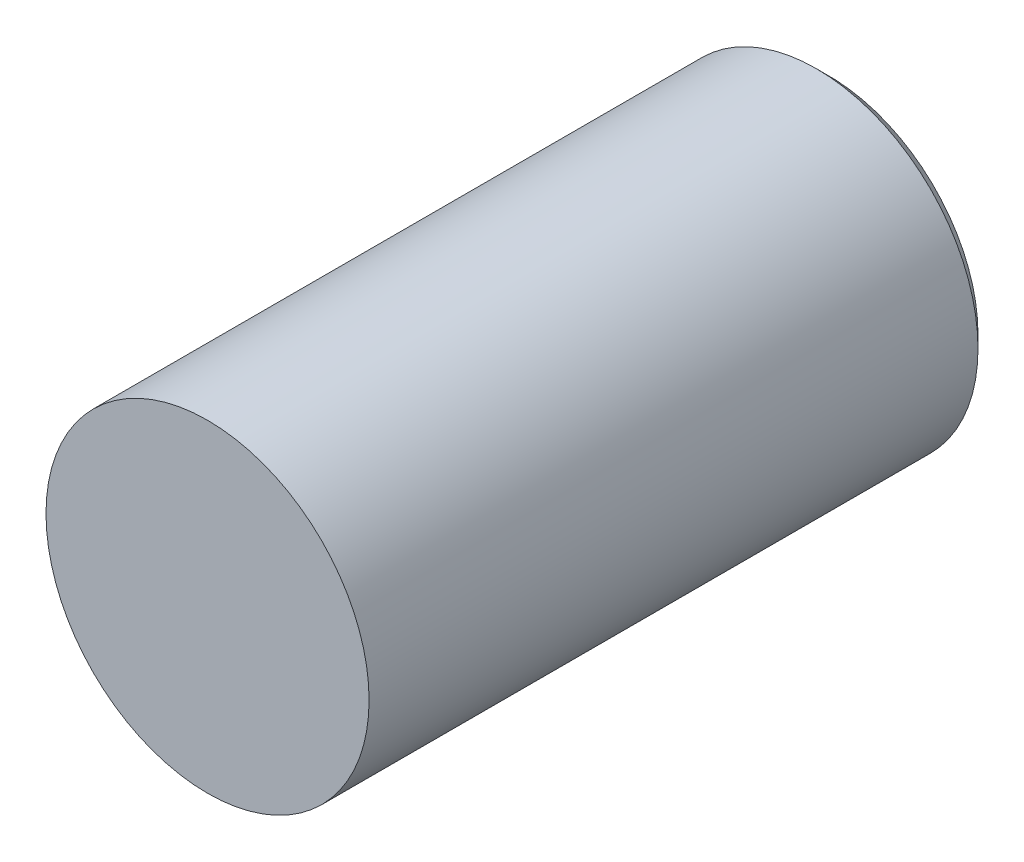
ISO-10303-21;
HEADER;
FILE_DESCRIPTION(('STEP AP214'),'2;1');
FILE_NAME('part.step','',(''),(''),'','','');
FILE_SCHEMA(('AUTOMOTIVE_DESIGN { 1 0 10303 214 1 1 1 1 }'));
ENDSEC;
DATA;
#1=APPLICATION_CONTEXT('core data for automotive mechanical design processes');
#2=APPLICATION_PROTOCOL_DEFINITION('international standard','automotive_design',2000,#1);
#3=PRODUCT_CONTEXT('',#1,'mechanical');
#4=PRODUCT('Part','Part','',(#3));
#5=PRODUCT_RELATED_PRODUCT_CATEGORY('part','',(#4));
#6=PRODUCT_DEFINITION_FORMATION('','',#4);
#7=PRODUCT_DEFINITION_CONTEXT('part definition',#1,'design');
#8=PRODUCT_DEFINITION('design','',#6,#7);
#9=PRODUCT_DEFINITION_SHAPE('','',#8);
#10=(LENGTH_UNIT() NAMED_UNIT(*) SI_UNIT(.MILLI.,.METRE.));
#11=(NAMED_UNIT(*) PLANE_ANGLE_UNIT() SI_UNIT($,.RADIAN.));
#12=(NAMED_UNIT(*) SI_UNIT($,.STERADIAN.) SOLID_ANGLE_UNIT());
#13=UNCERTAINTY_MEASURE_WITH_UNIT(LENGTH_MEASURE(1.E-05),#10,'distance_accuracy_value','');
#14=(GEOMETRIC_REPRESENTATION_CONTEXT(3) GLOBAL_UNCERTAINTY_ASSIGNED_CONTEXT((#13)) GLOBAL_UNIT_ASSIGNED_CONTEXT((#10,
#11,#12)) REPRESENTATION_CONTEXT('',''));
#15=CARTESIAN_POINT('',(0.,0.,0.));
#16=DIRECTION('',(0.,0.,1.));
#17=DIRECTION('',(1.,0.,0.));
#18=AXIS2_PLACEMENT_3D('',#15,#16,#17);
#19=CARTESIAN_POINT('',(0.,0.,15.));
#20=DIRECTION('',(0.,0.,-1.));
#21=DIRECTION('',(-1.,0.,0.));
#22=AXIS2_PLACEMENT_3D('',#19,#20,#21);
#23=CYLINDRICAL_SURFACE('',#22,2.6);
#24=CARTESIAN_POINT('',(0.,0.,0.300000000000003));
#25=DIRECTION('',(0.,0.,1.));
#26=DIRECTION('',(1.,0.,0.));
#27=AXIS2_PLACEMENT_3D('',#24,#25,#26);
#28=CIRCLE('',#27,2.6);
#29=CARTESIAN_POINT('',(2.6,0.,0.300000000000003));
#30=VERTEX_POINT('',#29);
#31=EDGE_CURVE('E128',#30,#30,#28,.F.);
#32=ORIENTED_EDGE('',*,*,#31,.T.);
#33=EDGE_LOOP('',(#32));
#34=FACE_BOUND('',#33,.T.);
#35=CARTESIAN_POINT('',(0.,0.,8.));
#36=DIRECTION('',(0.,0.,1.));
#37=DIRECTION('',(1.,0.,0.));
#38=AXIS2_PLACEMENT_3D('',#35,#36,#37);
#39=CIRCLE('',#38,2.6);
#40=CARTESIAN_POINT('',(1.6,2.04939015319192,8.));
#41=VERTEX_POINT('',#40);
#42=CARTESIAN_POINT('',(-1.6,2.04939015319192,8.));
#43=VERTEX_POINT('',#42);
#44=EDGE_CURVE('E106',#41,#43,#39,.T.);
#45=ORIENTED_EDGE('',*,*,#44,.T.);
#46=DIRECTION('',(0.,0.,1.));
#47=VECTOR('',#46,1.);
#48=CARTESIAN_POINT('',(-1.6,2.04939015319192,1.8));
#49=LINE('',#48,#47);
#50=CARTESIAN_POINT('',(-1.6,2.04939015319192,2.1));
#51=VERTEX_POINT('',#50);
#52=EDGE_CURVE('E96',#51,#43,#49,.T.);
#53=ORIENTED_EDGE('',*,*,#52,.F.);
#54=CARTESIAN_POINT('',(0.,0.,3.70000000000001));
#55=DIRECTION('',(0.70710678118655,0.,-0.707106781186546));
#56=DIRECTION('',(-0.707106781186546,0.,-0.70710678118655));
#57=AXIS2_PLACEMENT_3D('',#54,#55,#56);
#58=ELLIPSE('',#57,3.67695526217006,2.6);
#59=CARTESIAN_POINT('',(-1.9,1.77482393492988,1.8));
#60=VERTEX_POINT('',#59);
#61=EDGE_CURVE('E147',#51,#60,#58,.F.);
#62=ORIENTED_EDGE('',*,*,#61,.T.);
#63=CARTESIAN_POINT('',(0.,0.,1.8));
#64=DIRECTION('',(0.,0.,-1.));
#65=DIRECTION('',(-1.,0.,0.));
#66=AXIS2_PLACEMENT_3D('',#63,#64,#65);
#67=CIRCLE('',#66,2.6);
#68=CARTESIAN_POINT('',(-1.9,-1.77482393492988,1.8));
#69=VERTEX_POINT('',#68);
#70=EDGE_CURVE('E97',#69,#60,#67,.T.);
#71=ORIENTED_EDGE('',*,*,#70,.F.);
#72=CARTESIAN_POINT('',(0.,0.,3.70000000000001));
#73=DIRECTION('',(0.70710678118655,0.,-0.707106781186546));
#74=DIRECTION('',(-0.707106781186546,0.,-0.70710678118655));
#75=AXIS2_PLACEMENT_3D('',#72,#73,#74);
#76=ELLIPSE('',#75,3.67695526217006,2.6);
#77=CARTESIAN_POINT('',(-1.6,-2.04939015319192,2.1));
#78=VERTEX_POINT('',#77);
#79=EDGE_CURVE('E92',#69,#78,#76,.F.);
#80=ORIENTED_EDGE('',*,*,#79,.T.);
#81=DIRECTION('',(0.,0.,1.));
#82=VECTOR('',#81,1.);
#83=CARTESIAN_POINT('',(-1.6,-2.04939015319192,1.8));
#84=LINE('',#83,#82);
#85=CARTESIAN_POINT('',(-1.6,-2.04939015319192,8.));
#86=VERTEX_POINT('',#85);
#87=EDGE_CURVE('E86',#78,#86,#84,.T.);
#88=ORIENTED_EDGE('',*,*,#87,.T.);
#89=CARTESIAN_POINT('',(1.6,-2.04939015319192,8.));
#90=VERTEX_POINT('',#89);
#91=EDGE_CURVE('E89',#86,#90,#39,.T.);
#92=ORIENTED_EDGE('',*,*,#91,.T.);
#93=DIRECTION('',(0.,0.,1.));
#94=VECTOR('',#93,1.);
#95=CARTESIAN_POINT('',(1.6,-2.04939015319192,1.8));
#96=LINE('',#95,#94);
#97=CARTESIAN_POINT('',(1.6,-2.04939015319192,2.1));
#98=VERTEX_POINT('',#97);
#99=EDGE_CURVE('E118',#98,#90,#96,.T.);
#100=ORIENTED_EDGE('',*,*,#99,.F.);
#101=CARTESIAN_POINT('',(0.,0.,3.69999999999999));
#102=DIRECTION('',(0.707106781186546,0.,0.70710678118655));
#103=DIRECTION('',(0.70710678118655,0.,-0.707106781186546));
#104=AXIS2_PLACEMENT_3D('',#101,#102,#103);
#105=ELLIPSE('',#104,3.67695526217004,2.6);
#106=CARTESIAN_POINT('',(1.9,-1.77482393492988,1.8));
#107=VERTEX_POINT('',#106);
#108=EDGE_CURVE('E44',#98,#107,#105,.T.);
#109=ORIENTED_EDGE('',*,*,#108,.T.);
#110=CARTESIAN_POINT('',(0.,0.,1.8));
#111=DIRECTION('',(0.,0.,-1.));
#112=DIRECTION('',(-1.,0.,0.));
#113=AXIS2_PLACEMENT_3D('',#110,#111,#112);
#114=CIRCLE('',#113,2.6);
#115=CARTESIAN_POINT('',(1.9,1.77482393492988,1.8));
#116=VERTEX_POINT('',#115);
#117=EDGE_CURVE('E116',#116,#107,#114,.T.);
#118=ORIENTED_EDGE('',*,*,#117,.F.);
#119=CARTESIAN_POINT('',(0.,0.,3.69999999999999));
#120=DIRECTION('',(0.707106781186546,0.,0.70710678118655));
#121=DIRECTION('',(0.70710678118655,0.,-0.707106781186546));
#122=AXIS2_PLACEMENT_3D('',#119,#120,#121);
#123=ELLIPSE('',#122,3.67695526217004,2.6);
#124=CARTESIAN_POINT('',(1.6,2.04939015319192,2.1));
#125=VERTEX_POINT('',#124);
#126=EDGE_CURVE('E11',#116,#125,#123,.T.);
#127=ORIENTED_EDGE('',*,*,#126,.T.);
#128=DIRECTION('',(0.,0.,1.));
#129=VECTOR('',#128,1.);
#130=CARTESIAN_POINT('',(1.6,2.04939015319192,1.8));
#131=LINE('',#130,#129);
#132=EDGE_CURVE('E107',#125,#41,#131,.T.);
#133=ORIENTED_EDGE('',*,*,#132,.T.);
#134=EDGE_LOOP('',(#45,#53,#62,#71,#80,#88,#92,#100,#109,#118,#127,#133));
#135=FACE_BOUND('',#134,.T.);
#136=ADVANCED_FACE('F36',(#34,#135),#23,.F.);
#137=CARTESIAN_POINT('',(0.,0.,8.));
#138=DIRECTION('',(0.,0.,1.));
#139=DIRECTION('',(1.,0.,0.));
#140=AXIS2_PLACEMENT_3D('',#137,#138,#139);
#141=PLANE('',#140);
#142=DIRECTION('',(0.,-1.,0.));
#143=VECTOR('',#142,1.);
#144=CARTESIAN_POINT('',(-1.6,0.,8.));
#145=LINE('',#144,#143);
#146=EDGE_CURVE('E103',#43,#86,#145,.T.);
#147=ORIENTED_EDGE('',*,*,#146,.F.);
#148=ORIENTED_EDGE('',*,*,#44,.F.);
#149=DIRECTION('',(0.,-1.,0.));
#150=VECTOR('',#149,1.);
#151=CARTESIAN_POINT('',(1.6,0.,8.));
#152=LINE('',#151,#150);
#153=EDGE_CURVE('E105',#41,#90,#152,.T.);
#154=ORIENTED_EDGE('',*,*,#153,.T.);
#155=ORIENTED_EDGE('',*,*,#91,.F.);
#156=EDGE_LOOP('',(#147,#148,#154,#155));
#157=FACE_BOUND('',#156,.T.);
#158=ADVANCED_FACE('F101',(#157),#141,.F.);
#159=CARTESIAN_POINT('',(0.,0.,15.));
#160=DIRECTION('',(0.,0.,1.));
#161=DIRECTION('',(1.,0.,0.));
#162=AXIS2_PLACEMENT_3D('',#159,#160,#161);
#163=PLANE('',#162);
#164=CARTESIAN_POINT('',(0.,0.,15.));
#165=DIRECTION('',(0.,0.,1.));
#166=DIRECTION('',(1.,0.,0.));
#167=AXIS2_PLACEMENT_3D('',#164,#165,#166);
#168=CIRCLE('',#167,3.9);
#169=CARTESIAN_POINT('',(3.9,0.,15.));
#170=VERTEX_POINT('',#169);
#171=EDGE_CURVE('E122',#170,#170,#168,.T.);
#172=ORIENTED_EDGE('',*,*,#171,.T.);
#173=EDGE_LOOP('',(#172));
#174=FACE_BOUND('',#173,.T.);
#175=ADVANCED_FACE('F170',(#174),#163,.T.);
#176=CARTESIAN_POINT('',(0.,0.,0.));
#177=DIRECTION('',(0.,0.,1.));
#178=DIRECTION('',(1.,0.,0.));
#179=AXIS2_PLACEMENT_3D('',#176,#177,#178);
#180=PLANE('',#179);
#181=CARTESIAN_POINT('',(0.,0.,0.));
#182=DIRECTION('',(0.,0.,1.));
#183=DIRECTION('',(1.,0.,0.));
#184=AXIS2_PLACEMENT_3D('',#181,#182,#183);
#185=CIRCLE('',#184,3.6);
#186=CARTESIAN_POINT('',(3.6,0.,0.));
#187=VERTEX_POINT('',#186);
#188=EDGE_CURVE('E134',#187,#187,#185,.F.);
#189=ORIENTED_EDGE('',*,*,#188,.T.);
#190=EDGE_LOOP('',(#189));
#191=FACE_BOUND('',#190,.T.);
#192=CARTESIAN_POINT('',(0.,0.,0.));
#193=DIRECTION('',(0.,0.,1.));
#194=DIRECTION('',(1.,0.,0.));
#195=AXIS2_PLACEMENT_3D('',#192,#193,#194);
#196=CIRCLE('',#195,2.9);
#197=CARTESIAN_POINT('',(2.9,0.,0.));
#198=VERTEX_POINT('',#197);
#199=EDGE_CURVE('E125',#198,#198,#196,.T.);
#200=ORIENTED_EDGE('',*,*,#199,.T.);
#201=EDGE_LOOP('',(#200));
#202=FACE_BOUND('',#201,.T.);
#203=ADVANCED_FACE('F176',(#191,#202),#180,.F.);
#204=CARTESIAN_POINT('',(0.,0.,15.));
#205=DIRECTION('',(0.,0.,-1.));
#206=DIRECTION('',(-1.,0.,0.));
#207=AXIS2_PLACEMENT_3D('',#204,#205,#206);
#208=CYLINDRICAL_SURFACE('',#207,3.9);
#209=CARTESIAN_POINT('',(0.,0.,0.300000000000003));
#210=DIRECTION('',(0.,0.,1.));
#211=DIRECTION('',(1.,0.,0.));
#212=AXIS2_PLACEMENT_3D('',#209,#210,#211);
#213=CIRCLE('',#212,3.9);
#214=CARTESIAN_POINT('',(3.9,0.,0.300000000000003));
#215=VERTEX_POINT('',#214);
#216=EDGE_CURVE('E131',#215,#215,#213,.T.);
#217=ORIENTED_EDGE('',*,*,#216,.T.);
#218=EDGE_LOOP('',(#217));
#219=FACE_BOUND('',#218,.T.);
#220=ORIENTED_EDGE('',*,*,#171,.F.);
#221=EDGE_LOOP('',(#220));
#222=FACE_BOUND('',#221,.T.);
#223=ADVANCED_FACE('F180',(#219,#222),#208,.T.);
#224=CARTESIAN_POINT('',(1.6,0.,1.8));
#225=DIRECTION('',(-1.,0.,0.));
#226=DIRECTION('',(0.,0.,1.));
#227=AXIS2_PLACEMENT_3D('',#224,#225,#226);
#228=PLANE('',#227);
#229=ORIENTED_EDGE('',*,*,#132,.F.);
#230=DIRECTION('',(0.,-1.,0.));
#231=VECTOR('',#230,1.);
#232=CARTESIAN_POINT('',(1.6,0.,2.1));
#233=LINE('',#232,#231);
#234=EDGE_CURVE('E142',#125,#98,#233,.T.);
#235=ORIENTED_EDGE('',*,*,#234,.T.);
#236=ORIENTED_EDGE('',*,*,#99,.T.);
#237=ORIENTED_EDGE('',*,*,#153,.F.);
#238=EDGE_LOOP('',(#229,#235,#236,#237));
#239=FACE_BOUND('',#238,.T.);
#240=ADVANCED_FACE('F184',(#239),#228,.T.);
#241=CARTESIAN_POINT('',(0.,0.,1.8));
#242=DIRECTION('',(0.,0.,-1.));
#243=DIRECTION('',(-1.,0.,0.));
#244=AXIS2_PLACEMENT_3D('',#241,#242,#243);
#245=PLANE('',#244);
#246=ORIENTED_EDGE('',*,*,#117,.T.);
#247=DIRECTION('',(0.,1.,0.));
#248=VECTOR('',#247,1.);
#249=CARTESIAN_POINT('',(1.9,0.,1.8));
#250=LINE('',#249,#248);
#251=EDGE_CURVE('E56',#107,#116,#250,.T.);
#252=ORIENTED_EDGE('',*,*,#251,.T.);
#253=EDGE_LOOP('',(#246,#252));
#254=FACE_BOUND('',#253,.T.);
#255=ADVANCED_FACE('F199',(#254),#245,.T.);
#256=CARTESIAN_POINT('',(-1.6,0.,1.8));
#257=DIRECTION('',(-1.,0.,0.));
#258=DIRECTION('',(0.,0.,1.));
#259=AXIS2_PLACEMENT_3D('',#256,#257,#258);
#260=PLANE('',#259);
#261=ORIENTED_EDGE('',*,*,#87,.F.);
#262=DIRECTION('',(0.,1.,0.));
#263=VECTOR('',#262,1.);
#264=CARTESIAN_POINT('',(-1.6,2.04939015319192,2.1));
#265=LINE('',#264,#263);
#266=EDGE_CURVE('E140',#78,#51,#265,.T.);
#267=ORIENTED_EDGE('',*,*,#266,.T.);
#268=ORIENTED_EDGE('',*,*,#52,.T.);
#269=ORIENTED_EDGE('',*,*,#146,.T.);
#270=EDGE_LOOP('',(#261,#267,#268,#269));
#271=FACE_BOUND('',#270,.T.);
#272=ADVANCED_FACE('F109',(#271),#260,.F.);
#273=CARTESIAN_POINT('',(0.,0.,1.8));
#274=DIRECTION('',(0.,0.,-1.));
#275=DIRECTION('',(-1.,0.,0.));
#276=AXIS2_PLACEMENT_3D('',#273,#274,#275);
#277=PLANE('',#276);
#278=ORIENTED_EDGE('',*,*,#70,.T.);
#279=DIRECTION('',(0.,-1.,0.));
#280=VECTOR('',#279,1.);
#281=CARTESIAN_POINT('',(-1.9,-2.04939015319192,1.8));
#282=LINE('',#281,#280);
#283=EDGE_CURVE('E137',#60,#69,#282,.T.);
#284=ORIENTED_EDGE('',*,*,#283,.T.);
#285=EDGE_LOOP('',(#278,#284));
#286=FACE_BOUND('',#285,.T.);
#287=ADVANCED_FACE('F152',(#286),#277,.T.);
#288=CARTESIAN_POINT('',(0.,0.,0.));
#289=DIRECTION('',(0.,0.,-1.));
#290=DIRECTION('',(-1.,0.,0.));
#291=AXIS2_PLACEMENT_3D('',#288,#289,#290);
#292=CONICAL_SURFACE('',#291,2.9,0.785398163397445);
#293=ORIENTED_EDGE('',*,*,#31,.F.);
#294=EDGE_LOOP('',(#293));
#295=FACE_BOUND('',#294,.T.);
#296=ORIENTED_EDGE('',*,*,#199,.F.);
#297=EDGE_LOOP('',(#296));
#298=FACE_BOUND('',#297,.T.);
#299=ADVANCED_FACE('F161',(#295,#298),#292,.F.);
#300=CARTESIAN_POINT('',(0.,0.,0.300000000000003));
#301=DIRECTION('',(0.,0.,1.));
#302=DIRECTION('',(1.,0.,0.));
#303=AXIS2_PLACEMENT_3D('',#300,#301,#302);
#304=CONICAL_SURFACE('',#303,3.9,0.78539816339745);
#305=ORIENTED_EDGE('',*,*,#188,.F.);
#306=EDGE_LOOP('',(#305));
#307=FACE_BOUND('',#306,.T.);
#308=ORIENTED_EDGE('',*,*,#216,.F.);
#309=EDGE_LOOP('',(#308));
#310=FACE_BOUND('',#309,.T.);
#311=ADVANCED_FACE('F155',(#307,#310),#304,.T.);
#312=CARTESIAN_POINT('',(-1.9,0.,1.8));
#313=DIRECTION('',(0.70710678118655,0.,-0.707106781186546));
#314=DIRECTION('',(0.,1.,0.));
#315=AXIS2_PLACEMENT_3D('',#312,#313,#314);
#316=PLANE('',#315);
#317=ORIENTED_EDGE('',*,*,#61,.F.);
#318=ORIENTED_EDGE('',*,*,#266,.F.);
#319=ORIENTED_EDGE('',*,*,#79,.F.);
#320=ORIENTED_EDGE('',*,*,#283,.F.);
#321=EDGE_LOOP('',(#317,#318,#319,#320));
#322=FACE_BOUND('',#321,.T.);
#323=ADVANCED_FACE('F153',(#322),#316,.T.);
#324=CARTESIAN_POINT('',(1.6,0.,2.1));
#325=DIRECTION('',(0.707106781186546,0.,0.70710678118655));
#326=DIRECTION('',(0.,-1.,0.));
#327=AXIS2_PLACEMENT_3D('',#324,#325,#326);
#328=PLANE('',#327);
#329=ORIENTED_EDGE('',*,*,#126,.F.);
#330=ORIENTED_EDGE('',*,*,#251,.F.);
#331=ORIENTED_EDGE('',*,*,#108,.F.);
#332=ORIENTED_EDGE('',*,*,#234,.F.);
#333=EDGE_LOOP('',(#329,#330,#331,#332));
#334=FACE_BOUND('',#333,.T.);
#335=ADVANCED_FACE('F38',(#334),#328,.F.);
#336=CLOSED_SHELL('',(#136,#158,#175,#203,#223,#240,#255,#272,#287,#299,#311,#323,#335));
#337=MANIFOLD_SOLID_BREP('B2',#336);
#338=ADVANCED_BREP_SHAPE_REPRESENTATION('',(#18,#337),#14);
#339=SHAPE_DEFINITION_REPRESENTATION(#9,#338);
ENDSEC;
END-ISO-10303-21;
